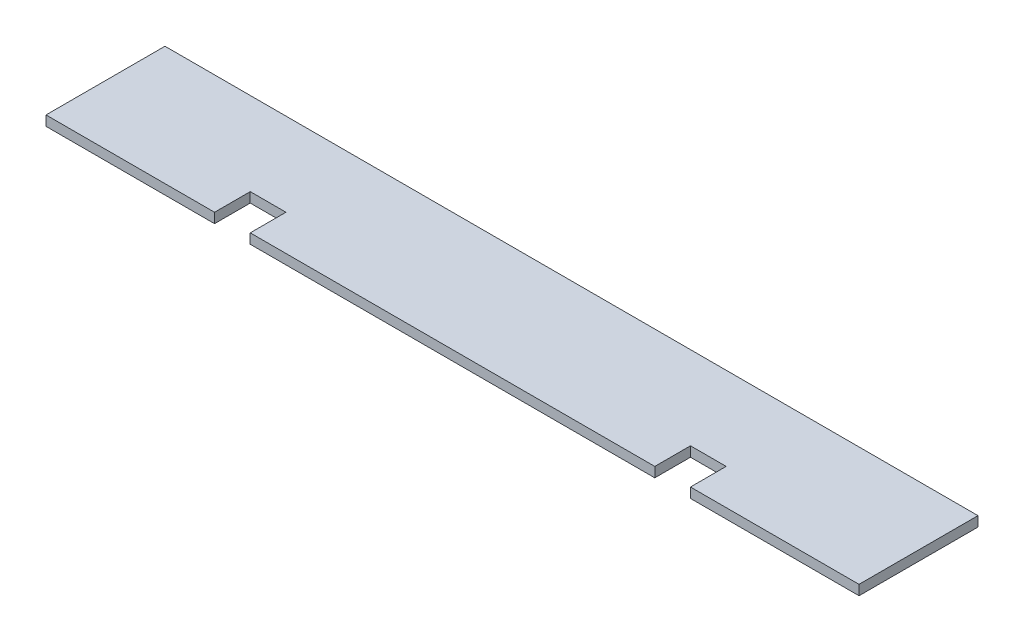
ISO-10303-21;
HEADER;
FILE_DESCRIPTION(('STEP AP214'),'2;1');
FILE_NAME('part.step','',(''),(''),'','','');
FILE_SCHEMA(('AUTOMOTIVE_DESIGN { 1 0 10303 214 1 1 1 1 }'));
ENDSEC;
DATA;
#1=APPLICATION_CONTEXT('core data for automotive mechanical design processes');
#2=APPLICATION_PROTOCOL_DEFINITION('international standard','automotive_design',2000,#1);
#3=PRODUCT_CONTEXT('',#1,'mechanical');
#4=PRODUCT('Part','Part','',(#3));
#5=PRODUCT_RELATED_PRODUCT_CATEGORY('part','',(#4));
#6=PRODUCT_DEFINITION_FORMATION('','',#4);
#7=PRODUCT_DEFINITION_CONTEXT('part definition',#1,'design');
#8=PRODUCT_DEFINITION('design','',#6,#7);
#9=PRODUCT_DEFINITION_SHAPE('','',#8);
#10=(LENGTH_UNIT() NAMED_UNIT(*) SI_UNIT(.MILLI.,.METRE.));
#11=(NAMED_UNIT(*) PLANE_ANGLE_UNIT() SI_UNIT($,.RADIAN.));
#12=(NAMED_UNIT(*) SI_UNIT($,.STERADIAN.) SOLID_ANGLE_UNIT());
#13=UNCERTAINTY_MEASURE_WITH_UNIT(LENGTH_MEASURE(1.E-05),#10,'distance_accuracy_value','');
#14=(GEOMETRIC_REPRESENTATION_CONTEXT(3) GLOBAL_UNCERTAINTY_ASSIGNED_CONTEXT((#13)) GLOBAL_UNIT_ASSIGNED_CONTEXT((#10,
#11,#12)) REPRESENTATION_CONTEXT('',''));
#15=CARTESIAN_POINT('',(0.,0.,0.));
#16=DIRECTION('',(0.,0.,1.));
#17=DIRECTION('',(1.,0.,0.));
#18=AXIS2_PLACEMENT_3D('',#15,#16,#17);
#19=CARTESIAN_POINT('',(0.,25.,0.));
#20=DIRECTION('',(0.,0.,-1.));
#21=DIRECTION('',(-1.,0.,0.));
#22=AXIS2_PLACEMENT_3D('',#19,#20,#21);
#23=PLANE('',#22);
#24=DIRECTION('',(1.,0.,0.));
#25=VECTOR('',#24,1.);
#26=CARTESIAN_POINT('',(0.,25.,0.));
#27=LINE('',#26,#25);
#28=CARTESIAN_POINT('',(1625.,25.,0.));
#29=VERTEX_POINT('',#28);
#30=CARTESIAN_POINT('',(2050.,25.,0.));
#31=VERTEX_POINT('',#30);
#32=EDGE_CURVE('E189',#29,#31,#27,.T.);
#33=ORIENTED_EDGE('',*,*,#32,.F.);
#34=DIRECTION('',(0.,1.,0.));
#35=VECTOR('',#34,1.);
#36=CARTESIAN_POINT('',(1625.,-0.001000000000001,0.));
#37=LINE('',#36,#35);
#38=CARTESIAN_POINT('',(1625.,0.,0.));
#39=VERTEX_POINT('',#38);
#40=EDGE_CURVE('E132',#39,#29,#37,.T.);
#41=ORIENTED_EDGE('',*,*,#40,.F.);
#42=DIRECTION('',(1.,0.,0.));
#43=VECTOR('',#42,1.);
#44=CARTESIAN_POINT('',(0.,0.,0.));
#45=LINE('',#44,#43);
#46=CARTESIAN_POINT('',(2050.,0.,0.));
#47=VERTEX_POINT('',#46);
#48=EDGE_CURVE('E147',#39,#47,#45,.T.);
#49=ORIENTED_EDGE('',*,*,#48,.T.);
#50=DIRECTION('',(0.,-1.,0.));
#51=VECTOR('',#50,1.);
#52=CARTESIAN_POINT('',(2050.,25.,0.));
#53=LINE('',#52,#51);
#54=EDGE_CURVE('E41',#31,#47,#53,.T.);
#55=ORIENTED_EDGE('',*,*,#54,.F.);
#56=EDGE_LOOP('',(#33,#41,#49,#55));
#57=FACE_BOUND('',#56,.T.);
#58=ADVANCED_FACE('F33',(#57),#23,.F.);
#59=CARTESIAN_POINT('',(0.,0.,0.));
#60=VERTEX_POINT('',#59);
#61=CARTESIAN_POINT('',(425.,0.,0.));
#62=VERTEX_POINT('',#61);
#63=EDGE_CURVE('E146',#60,#62,#45,.T.);
#64=ORIENTED_EDGE('',*,*,#63,.T.);
#65=DIRECTION('',(0.,1.,0.));
#66=VECTOR('',#65,1.);
#67=CARTESIAN_POINT('',(425.,-0.001000000000001,0.));
#68=LINE('',#67,#66);
#69=CARTESIAN_POINT('',(425.,25.,0.));
#70=VERTEX_POINT('',#69);
#71=EDGE_CURVE('E195',#62,#70,#68,.T.);
#72=ORIENTED_EDGE('',*,*,#71,.T.);
#73=CARTESIAN_POINT('',(0.,25.,0.));
#74=VERTEX_POINT('',#73);
#75=EDGE_CURVE('E193',#74,#70,#27,.T.);
#76=ORIENTED_EDGE('',*,*,#75,.F.);
#77=DIRECTION('',(0.,-1.,0.));
#78=VECTOR('',#77,1.);
#79=CARTESIAN_POINT('',(0.,25.,0.));
#80=LINE('',#79,#78);
#81=EDGE_CURVE('E11',#74,#60,#80,.T.);
#82=ORIENTED_EDGE('',*,*,#81,.T.);
#83=EDGE_LOOP('',(#64,#72,#76,#82));
#84=FACE_BOUND('',#83,.T.);
#85=ADVANCED_FACE('F233',(#84),#23,.F.);
#86=CARTESIAN_POINT('',(0.,25.,0.));
#87=DIRECTION('',(1.,0.,0.));
#88=DIRECTION('',(0.,0.,-1.));
#89=AXIS2_PLACEMENT_3D('',#86,#87,#88);
#90=PLANE('',#89);
#91=DIRECTION('',(0.,0.,1.));
#92=VECTOR('',#91,1.);
#93=CARTESIAN_POINT('',(0.,0.,0.));
#94=LINE('',#93,#92);
#95=CARTESIAN_POINT('',(0.,0.,-300.));
#96=VERTEX_POINT('',#95);
#97=EDGE_CURVE('E151',#96,#60,#94,.T.);
#98=ORIENTED_EDGE('',*,*,#97,.T.);
#99=ORIENTED_EDGE('',*,*,#81,.F.);
#100=DIRECTION('',(0.,0.,1.));
#101=VECTOR('',#100,1.);
#102=CARTESIAN_POINT('',(0.,25.,0.));
#103=LINE('',#102,#101);
#104=CARTESIAN_POINT('',(0.,25.,-300.));
#105=VERTEX_POINT('',#104);
#106=EDGE_CURVE('E158',#105,#74,#103,.T.);
#107=ORIENTED_EDGE('',*,*,#106,.F.);
#108=DIRECTION('',(0.,-1.,0.));
#109=VECTOR('',#108,1.);
#110=CARTESIAN_POINT('',(0.,25.,-300.));
#111=LINE('',#110,#109);
#112=EDGE_CURVE('E159',#105,#96,#111,.T.);
#113=ORIENTED_EDGE('',*,*,#112,.T.);
#114=EDGE_LOOP('',(#98,#99,#107,#113));
#115=FACE_BOUND('',#114,.T.);
#116=ADVANCED_FACE('F35',(#115),#90,.F.);
#117=CARTESIAN_POINT('',(515.,0.,0.));
#118=VERTEX_POINT('',#117);
#119=CARTESIAN_POINT('',(1535.,0.,0.));
#120=VERTEX_POINT('',#119);
#121=EDGE_CURVE('E139',#118,#120,#45,.T.);
#122=ORIENTED_EDGE('',*,*,#121,.T.);
#123=DIRECTION('',(0.,1.,0.));
#124=VECTOR('',#123,1.);
#125=CARTESIAN_POINT('',(1535.,-0.001000000000001,0.));
#126=LINE('',#125,#124);
#127=CARTESIAN_POINT('',(1535.,25.,0.));
#128=VERTEX_POINT('',#127);
#129=EDGE_CURVE('E121',#120,#128,#126,.T.);
#130=ORIENTED_EDGE('',*,*,#129,.T.);
#131=CARTESIAN_POINT('',(515.,25.,0.));
#132=VERTEX_POINT('',#131);
#133=EDGE_CURVE('E191',#132,#128,#27,.T.);
#134=ORIENTED_EDGE('',*,*,#133,.F.);
#135=DIRECTION('',(0.,1.,0.));
#136=VECTOR('',#135,1.);
#137=CARTESIAN_POINT('',(515.,-0.001000000000001,0.));
#138=LINE('',#137,#136);
#139=EDGE_CURVE('E145',#118,#132,#138,.T.);
#140=ORIENTED_EDGE('',*,*,#139,.F.);
#141=EDGE_LOOP('',(#122,#130,#134,#140));
#142=FACE_BOUND('',#141,.T.);
#143=ADVANCED_FACE('F144',(#142),#23,.F.);
#144=CARTESIAN_POINT('',(2050.,25.,0.));
#145=DIRECTION('',(-1.,0.,0.));
#146=DIRECTION('',(0.,0.,1.));
#147=AXIS2_PLACEMENT_3D('',#144,#145,#146);
#148=PLANE('',#147);
#149=DIRECTION('',(0.,0.,-1.));
#150=VECTOR('',#149,1.);
#151=CARTESIAN_POINT('',(2050.,0.,0.));
#152=LINE('',#151,#150);
#153=CARTESIAN_POINT('',(2050.,0.,-300.));
#154=VERTEX_POINT('',#153);
#155=EDGE_CURVE('E150',#47,#154,#152,.T.);
#156=ORIENTED_EDGE('',*,*,#155,.T.);
#157=DIRECTION('',(0.,-1.,0.));
#158=VECTOR('',#157,1.);
#159=CARTESIAN_POINT('',(2050.,25.,-300.));
#160=LINE('',#159,#158);
#161=CARTESIAN_POINT('',(2050.,25.,-300.));
#162=VERTEX_POINT('',#161);
#163=EDGE_CURVE('E162',#162,#154,#160,.T.);
#164=ORIENTED_EDGE('',*,*,#163,.F.);
#165=DIRECTION('',(0.,0.,-1.));
#166=VECTOR('',#165,1.);
#167=CARTESIAN_POINT('',(2050.,25.,0.));
#168=LINE('',#167,#166);
#169=EDGE_CURVE('E172',#31,#162,#168,.T.);
#170=ORIENTED_EDGE('',*,*,#169,.F.);
#171=ORIENTED_EDGE('',*,*,#54,.T.);
#172=EDGE_LOOP('',(#156,#164,#170,#171));
#173=FACE_BOUND('',#172,.T.);
#174=ADVANCED_FACE('F170',(#173),#148,.F.);
#175=CARTESIAN_POINT('',(0.,25.,-300.));
#176=DIRECTION('',(0.,0.,1.));
#177=DIRECTION('',(1.,0.,0.));
#178=AXIS2_PLACEMENT_3D('',#175,#176,#177);
#179=PLANE('',#178);
#180=DIRECTION('',(-1.,0.,0.));
#181=VECTOR('',#180,1.);
#182=CARTESIAN_POINT('',(0.,0.,-300.));
#183=LINE('',#182,#181);
#184=EDGE_CURVE('E156',#154,#96,#183,.T.);
#185=ORIENTED_EDGE('',*,*,#184,.T.);
#186=ORIENTED_EDGE('',*,*,#112,.F.);
#187=DIRECTION('',(-1.,0.,0.));
#188=VECTOR('',#187,1.);
#189=CARTESIAN_POINT('',(0.,25.,-300.));
#190=LINE('',#189,#188);
#191=EDGE_CURVE('E163',#162,#105,#190,.T.);
#192=ORIENTED_EDGE('',*,*,#191,.F.);
#193=ORIENTED_EDGE('',*,*,#163,.T.);
#194=EDGE_LOOP('',(#185,#186,#192,#193));
#195=FACE_BOUND('',#194,.T.);
#196=ADVANCED_FACE('F181',(#195),#179,.F.);
#197=CARTESIAN_POINT('',(0.,25.,0.));
#198=DIRECTION('',(0.,-1.,0.));
#199=DIRECTION('',(0.,0.,-1.));
#200=AXIS2_PLACEMENT_3D('',#197,#198,#199);
#201=PLANE('',#200);
#202=DIRECTION('',(-1.,0.,0.));
#203=VECTOR('',#202,1.);
#204=CARTESIAN_POINT('',(1625.,25.,-90.));
#205=LINE('',#204,#203);
#206=CARTESIAN_POINT('',(1625.,25.,-90.));
#207=VERTEX_POINT('',#206);
#208=CARTESIAN_POINT('',(1535.,25.,-90.));
#209=VERTEX_POINT('',#208);
#210=EDGE_CURVE('E242',#207,#209,#205,.T.);
#211=ORIENTED_EDGE('',*,*,#210,.F.);
#212=DIRECTION('',(0.,0.,-1.));
#213=VECTOR('',#212,1.);
#214=CARTESIAN_POINT('',(1625.,25.,0.));
#215=LINE('',#214,#213);
#216=EDGE_CURVE('E202',#29,#207,#215,.T.);
#217=ORIENTED_EDGE('',*,*,#216,.F.);
#218=ORIENTED_EDGE('',*,*,#32,.T.);
#219=ORIENTED_EDGE('',*,*,#169,.T.);
#220=ORIENTED_EDGE('',*,*,#191,.T.);
#221=ORIENTED_EDGE('',*,*,#106,.T.);
#222=ORIENTED_EDGE('',*,*,#75,.T.);
#223=DIRECTION('',(0.,0.,1.));
#224=VECTOR('',#223,1.);
#225=CARTESIAN_POINT('',(425.,25.,0.));
#226=LINE('',#225,#224);
#227=CARTESIAN_POINT('',(425.,25.,-90.));
#228=VERTEX_POINT('',#227);
#229=EDGE_CURVE('E221',#228,#70,#226,.T.);
#230=ORIENTED_EDGE('',*,*,#229,.F.);
#231=DIRECTION('',(-1.,0.,0.));
#232=VECTOR('',#231,1.);
#233=CARTESIAN_POINT('',(425.,25.,-90.));
#234=LINE('',#233,#232);
#235=CARTESIAN_POINT('',(515.,25.,-90.));
#236=VERTEX_POINT('',#235);
#237=EDGE_CURVE('E225',#236,#228,#234,.T.);
#238=ORIENTED_EDGE('',*,*,#237,.F.);
#239=DIRECTION('',(0.,0.,-1.));
#240=VECTOR('',#239,1.);
#241=CARTESIAN_POINT('',(515.,25.,0.));
#242=LINE('',#241,#240);
#243=EDGE_CURVE('E223',#132,#236,#242,.T.);
#244=ORIENTED_EDGE('',*,*,#243,.F.);
#245=ORIENTED_EDGE('',*,*,#133,.T.);
#246=DIRECTION('',(0.,0.,1.));
#247=VECTOR('',#246,1.);
#248=CARTESIAN_POINT('',(1535.,25.,0.));
#249=LINE('',#248,#247);
#250=EDGE_CURVE('E127',#209,#128,#249,.T.);
#251=ORIENTED_EDGE('',*,*,#250,.F.);
#252=EDGE_LOOP('',(#211,#217,#218,#219,#220,#221,#222,#230,#238,#244,#245,#251));
#253=FACE_BOUND('',#252,.T.);
#254=ADVANCED_FACE('F199',(#253),#201,.F.);
#255=CARTESIAN_POINT('',(0.,0.,0.));
#256=DIRECTION('',(0.,-1.,0.));
#257=DIRECTION('',(0.,0.,-1.));
#258=AXIS2_PLACEMENT_3D('',#255,#256,#257);
#259=PLANE('',#258);
#260=DIRECTION('',(0.,0.,-1.));
#261=VECTOR('',#260,1.);
#262=CARTESIAN_POINT('',(1625.,0.,0.));
#263=LINE('',#262,#261);
#264=CARTESIAN_POINT('',(1625.,0.,-90.));
#265=VERTEX_POINT('',#264);
#266=EDGE_CURVE('E141',#39,#265,#263,.T.);
#267=ORIENTED_EDGE('',*,*,#266,.T.);
#268=DIRECTION('',(-1.,0.,0.));
#269=VECTOR('',#268,1.);
#270=CARTESIAN_POINT('',(1625.,0.,-90.));
#271=LINE('',#270,#269);
#272=CARTESIAN_POINT('',(1535.,0.,-90.));
#273=VERTEX_POINT('',#272);
#274=EDGE_CURVE('E140',#265,#273,#271,.T.);
#275=ORIENTED_EDGE('',*,*,#274,.T.);
#276=DIRECTION('',(0.,0.,1.));
#277=VECTOR('',#276,1.);
#278=CARTESIAN_POINT('',(1535.,0.,0.));
#279=LINE('',#278,#277);
#280=EDGE_CURVE('E124',#273,#120,#279,.T.);
#281=ORIENTED_EDGE('',*,*,#280,.T.);
#282=ORIENTED_EDGE('',*,*,#121,.F.);
#283=DIRECTION('',(0.,0.,-1.));
#284=VECTOR('',#283,1.);
#285=CARTESIAN_POINT('',(515.,0.,0.));
#286=LINE('',#285,#284);
#287=CARTESIAN_POINT('',(515.,0.,-90.));
#288=VERTEX_POINT('',#287);
#289=EDGE_CURVE('E206',#118,#288,#286,.T.);
#290=ORIENTED_EDGE('',*,*,#289,.T.);
#291=DIRECTION('',(-1.,0.,0.));
#292=VECTOR('',#291,1.);
#293=CARTESIAN_POINT('',(425.,0.,-90.));
#294=LINE('',#293,#292);
#295=CARTESIAN_POINT('',(425.,0.,-90.));
#296=VERTEX_POINT('',#295);
#297=EDGE_CURVE('E215',#288,#296,#294,.T.);
#298=ORIENTED_EDGE('',*,*,#297,.T.);
#299=DIRECTION('',(0.,0.,1.));
#300=VECTOR('',#299,1.);
#301=CARTESIAN_POINT('',(425.,0.,0.));
#302=LINE('',#301,#300);
#303=EDGE_CURVE('E218',#296,#62,#302,.T.);
#304=ORIENTED_EDGE('',*,*,#303,.T.);
#305=ORIENTED_EDGE('',*,*,#63,.F.);
#306=ORIENTED_EDGE('',*,*,#97,.F.);
#307=ORIENTED_EDGE('',*,*,#184,.F.);
#308=ORIENTED_EDGE('',*,*,#155,.F.);
#309=ORIENTED_EDGE('',*,*,#48,.F.);
#310=EDGE_LOOP('',(#267,#275,#281,#282,#290,#298,#304,#305,#306,#307,#308,#309));
#311=FACE_BOUND('',#310,.T.);
#312=ADVANCED_FACE('F137',(#311),#259,.T.);
#313=CARTESIAN_POINT('',(425.,-0.001000000000001,0.));
#314=DIRECTION('',(-1.,0.,0.));
#315=DIRECTION('',(0.,0.,1.));
#316=AXIS2_PLACEMENT_3D('',#313,#314,#315);
#317=PLANE('',#316);
#318=DIRECTION('',(0.,1.,0.));
#319=VECTOR('',#318,1.);
#320=CARTESIAN_POINT('',(425.,-0.001000000000001,-90.));
#321=LINE('',#320,#319);
#322=EDGE_CURVE('E228',#296,#228,#321,.T.);
#323=ORIENTED_EDGE('',*,*,#322,.T.);
#324=ORIENTED_EDGE('',*,*,#229,.T.);
#325=ORIENTED_EDGE('',*,*,#71,.F.);
#326=ORIENTED_EDGE('',*,*,#303,.F.);
#327=EDGE_LOOP('',(#323,#324,#325,#326));
#328=FACE_BOUND('',#327,.T.);
#329=ADVANCED_FACE('F237',(#328),#317,.F.);
#330=CARTESIAN_POINT('',(425.,-0.001000000000001,-90.));
#331=DIRECTION('',(0.,0.,-1.));
#332=DIRECTION('',(-1.,0.,0.));
#333=AXIS2_PLACEMENT_3D('',#330,#331,#332);
#334=PLANE('',#333);
#335=DIRECTION('',(0.,1.,0.));
#336=VECTOR('',#335,1.);
#337=CARTESIAN_POINT('',(515.,-0.001000000000001,-90.));
#338=LINE('',#337,#336);
#339=EDGE_CURVE('E56',#288,#236,#338,.T.);
#340=ORIENTED_EDGE('',*,*,#339,.T.);
#341=ORIENTED_EDGE('',*,*,#237,.T.);
#342=ORIENTED_EDGE('',*,*,#322,.F.);
#343=ORIENTED_EDGE('',*,*,#297,.F.);
#344=EDGE_LOOP('',(#340,#341,#342,#343));
#345=FACE_BOUND('',#344,.T.);
#346=ADVANCED_FACE('F240',(#345),#334,.F.);
#347=CARTESIAN_POINT('',(515.,-0.001000000000001,0.));
#348=DIRECTION('',(1.,0.,0.));
#349=DIRECTION('',(0.,0.,-1.));
#350=AXIS2_PLACEMENT_3D('',#347,#348,#349);
#351=PLANE('',#350);
#352=ORIENTED_EDGE('',*,*,#139,.T.);
#353=ORIENTED_EDGE('',*,*,#243,.T.);
#354=ORIENTED_EDGE('',*,*,#339,.F.);
#355=ORIENTED_EDGE('',*,*,#289,.F.);
#356=EDGE_LOOP('',(#352,#353,#354,#355));
#357=FACE_BOUND('',#356,.T.);
#358=ADVANCED_FACE('F241',(#357),#351,.F.);
#359=CARTESIAN_POINT('',(1625.,-0.001000000000001,0.));
#360=DIRECTION('',(1.,0.,0.));
#361=DIRECTION('',(0.,0.,-1.));
#362=AXIS2_PLACEMENT_3D('',#359,#360,#361);
#363=PLANE('',#362);
#364=ORIENTED_EDGE('',*,*,#40,.T.);
#365=ORIENTED_EDGE('',*,*,#216,.T.);
#366=DIRECTION('',(0.,1.,0.));
#367=VECTOR('',#366,1.);
#368=CARTESIAN_POINT('',(1625.,-0.001000000000001,-90.));
#369=LINE('',#368,#367);
#370=EDGE_CURVE('E212',#265,#207,#369,.T.);
#371=ORIENTED_EDGE('',*,*,#370,.F.);
#372=ORIENTED_EDGE('',*,*,#266,.F.);
#373=EDGE_LOOP('',(#364,#365,#371,#372));
#374=FACE_BOUND('',#373,.T.);
#375=ADVANCED_FACE('F246',(#374),#363,.F.);
#376=CARTESIAN_POINT('',(1535.,-0.001000000000001,0.));
#377=DIRECTION('',(-1.,0.,0.));
#378=DIRECTION('',(0.,0.,1.));
#379=AXIS2_PLACEMENT_3D('',#376,#377,#378);
#380=PLANE('',#379);
#381=DIRECTION('',(0.,1.,0.));
#382=VECTOR('',#381,1.);
#383=CARTESIAN_POINT('',(1535.,-0.001000000000001,-90.));
#384=LINE('',#383,#382);
#385=EDGE_CURVE('E48',#273,#209,#384,.T.);
#386=ORIENTED_EDGE('',*,*,#385,.T.);
#387=ORIENTED_EDGE('',*,*,#250,.T.);
#388=ORIENTED_EDGE('',*,*,#129,.F.);
#389=ORIENTED_EDGE('',*,*,#280,.F.);
#390=EDGE_LOOP('',(#386,#387,#388,#389));
#391=FACE_BOUND('',#390,.T.);
#392=ADVANCED_FACE('F123',(#391),#380,.F.);
#393=CARTESIAN_POINT('',(1625.,-0.001000000000001,-90.));
#394=DIRECTION('',(0.,0.,-1.));
#395=DIRECTION('',(-1.,0.,0.));
#396=AXIS2_PLACEMENT_3D('',#393,#394,#395);
#397=PLANE('',#396);
#398=ORIENTED_EDGE('',*,*,#370,.T.);
#399=ORIENTED_EDGE('',*,*,#210,.T.);
#400=ORIENTED_EDGE('',*,*,#385,.F.);
#401=ORIENTED_EDGE('',*,*,#274,.F.);
#402=EDGE_LOOP('',(#398,#399,#400,#401));
#403=FACE_BOUND('',#402,.T.);
#404=ADVANCED_FACE('F247',(#403),#397,.F.);
#405=CLOSED_SHELL('',(#58,#85,#116,#143,#174,#196,#254,#312,#329,#346,#358,#375,#392,#404));
#406=MANIFOLD_SOLID_BREP('B2',#405);
#407=ADVANCED_BREP_SHAPE_REPRESENTATION('',(#18,#406),#14);
#408=SHAPE_DEFINITION_REPRESENTATION(#9,#407);
ENDSEC;
END-ISO-10303-21;
